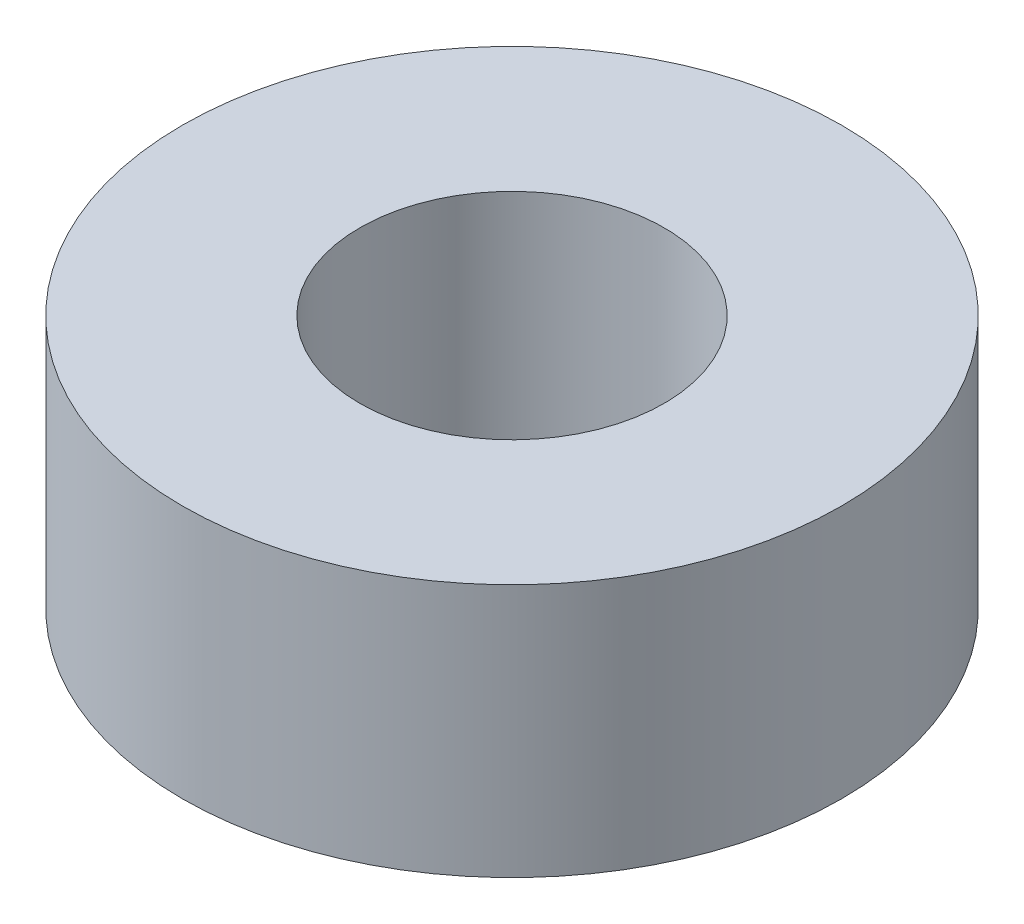
ISO-10303-21;
HEADER;
FILE_DESCRIPTION(('STEP AP214'),'2;1');
FILE_NAME('part.step','',(''),(''),'','','');
FILE_SCHEMA(('AUTOMOTIVE_DESIGN { 1 0 10303 214 1 1 1 1 }'));
ENDSEC;
DATA;
#1=APPLICATION_CONTEXT('core data for automotive mechanical design processes');
#2=APPLICATION_PROTOCOL_DEFINITION('international standard','automotive_design',2000,#1);
#3=PRODUCT_CONTEXT('',#1,'mechanical');
#4=PRODUCT('Part','Part','',(#3));
#5=PRODUCT_RELATED_PRODUCT_CATEGORY('part','',(#4));
#6=PRODUCT_DEFINITION_FORMATION('','',#4);
#7=PRODUCT_DEFINITION_CONTEXT('part definition',#1,'design');
#8=PRODUCT_DEFINITION('design','',#6,#7);
#9=PRODUCT_DEFINITION_SHAPE('','',#8);
#10=(LENGTH_UNIT() NAMED_UNIT(*) SI_UNIT(.MILLI.,.METRE.));
#11=(NAMED_UNIT(*) PLANE_ANGLE_UNIT() SI_UNIT($,.RADIAN.));
#12=(NAMED_UNIT(*) SI_UNIT($,.STERADIAN.) SOLID_ANGLE_UNIT());
#13=UNCERTAINTY_MEASURE_WITH_UNIT(LENGTH_MEASURE(1.E-05),#10,'distance_accuracy_value','');
#14=(GEOMETRIC_REPRESENTATION_CONTEXT(3) GLOBAL_UNCERTAINTY_ASSIGNED_CONTEXT((#13)) GLOBAL_UNIT_ASSIGNED_CONTEXT((#10,
#11,#12)) REPRESENTATION_CONTEXT('',''));
#15=CARTESIAN_POINT('',(0.,0.,0.));
#16=DIRECTION('',(0.,0.,1.));
#17=DIRECTION('',(1.,0.,0.));
#18=AXIS2_PLACEMENT_3D('',#15,#16,#17);
#19=CARTESIAN_POINT('',(0.,5.,0.));
#20=DIRECTION('',(0.,1.,0.));
#21=DIRECTION('',(0.,0.,1.));
#22=AXIS2_PLACEMENT_3D('',#19,#20,#21);
#23=PLANE('',#22);
#24=CARTESIAN_POINT('',(0.,5.,0.));
#25=DIRECTION('',(0.,1.,0.));
#26=DIRECTION('',(0.,0.,1.));
#27=AXIS2_PLACEMENT_3D('',#24,#25,#26);
#28=CIRCLE('',#27,6.5);
#29=CARTESIAN_POINT('',(0.,5.,6.5));
#30=VERTEX_POINT('',#29);
#31=EDGE_CURVE('E10',#30,#30,#28,.T.);
#32=ORIENTED_EDGE('',*,*,#31,.T.);
#33=EDGE_LOOP('',(#32));
#34=FACE_BOUND('',#33,.T.);
#35=CARTESIAN_POINT('',(0.,5.,0.));
#36=DIRECTION('',(0.,1.,0.));
#37=DIRECTION('',(0.,0.,1.));
#38=AXIS2_PLACEMENT_3D('',#35,#36,#37);
#39=CIRCLE('',#38,3.);
#40=CARTESIAN_POINT('',(0.,5.,3.));
#41=VERTEX_POINT('',#40);
#42=EDGE_CURVE('E56',#41,#41,#39,.T.);
#43=ORIENTED_EDGE('',*,*,#42,.F.);
#44=EDGE_LOOP('',(#43));
#45=FACE_BOUND('',#44,.T.);
#46=ADVANCED_FACE('F43',(#34,#45),#23,.T.);
#47=CARTESIAN_POINT('',(0.,0.,0.));
#48=DIRECTION('',(0.,1.,0.));
#49=DIRECTION('',(0.,0.,1.));
#50=AXIS2_PLACEMENT_3D('',#47,#48,#49);
#51=PLANE('',#50);
#52=CARTESIAN_POINT('',(0.,0.,0.));
#53=DIRECTION('',(0.,1.,0.));
#54=DIRECTION('',(0.,0.,1.));
#55=AXIS2_PLACEMENT_3D('',#52,#53,#54);
#56=CIRCLE('',#55,6.5);
#57=CARTESIAN_POINT('',(0.,0.,6.5));
#58=VERTEX_POINT('',#57);
#59=EDGE_CURVE('E47',#58,#58,#56,.T.);
#60=ORIENTED_EDGE('',*,*,#59,.F.);
#61=EDGE_LOOP('',(#60));
#62=FACE_BOUND('',#61,.T.);
#63=CARTESIAN_POINT('',(0.,0.,0.));
#64=DIRECTION('',(0.,1.,0.));
#65=DIRECTION('',(0.,0.,1.));
#66=AXIS2_PLACEMENT_3D('',#63,#64,#65);
#67=CIRCLE('',#66,3.);
#68=CARTESIAN_POINT('',(0.,0.,3.));
#69=VERTEX_POINT('',#68);
#70=EDGE_CURVE('E58',#69,#69,#67,.T.);
#71=ORIENTED_EDGE('',*,*,#70,.T.);
#72=EDGE_LOOP('',(#71));
#73=FACE_BOUND('',#72,.T.);
#74=ADVANCED_FACE('F70',(#62,#73),#51,.F.);
#75=CARTESIAN_POINT('',(0.,5.,0.));
#76=DIRECTION('',(0.,-1.,0.));
#77=DIRECTION('',(0.,0.,-1.));
#78=AXIS2_PLACEMENT_3D('',#75,#76,#77);
#79=CYLINDRICAL_SURFACE('',#78,6.5);
#80=ORIENTED_EDGE('',*,*,#31,.F.);
#81=EDGE_LOOP('',(#80));
#82=FACE_BOUND('',#81,.T.);
#83=ORIENTED_EDGE('',*,*,#59,.T.);
#84=EDGE_LOOP('',(#83));
#85=FACE_BOUND('',#84,.T.);
#86=ADVANCED_FACE('F45',(#82,#85),#79,.T.);
#87=CARTESIAN_POINT('',(0.,5.,0.));
#88=DIRECTION('',(0.,-1.,0.));
#89=DIRECTION('',(0.,0.,-1.));
#90=AXIS2_PLACEMENT_3D('',#87,#88,#89);
#91=CYLINDRICAL_SURFACE('',#90,3.);
#92=ORIENTED_EDGE('',*,*,#42,.T.);
#93=EDGE_LOOP('',(#92));
#94=FACE_BOUND('',#93,.T.);
#95=ORIENTED_EDGE('',*,*,#70,.F.);
#96=EDGE_LOOP('',(#95));
#97=FACE_BOUND('',#96,.T.);
#98=ADVANCED_FACE('F66',(#94,#97),#91,.F.);
#99=CLOSED_SHELL('',(#46,#74,#86,#98));
#100=MANIFOLD_SOLID_BREP('B2',#99);
#101=ADVANCED_BREP_SHAPE_REPRESENTATION('',(#18,#100),#14);
#102=SHAPE_DEFINITION_REPRESENTATION(#9,#101);
ENDSEC;
END-ISO-10303-21;
